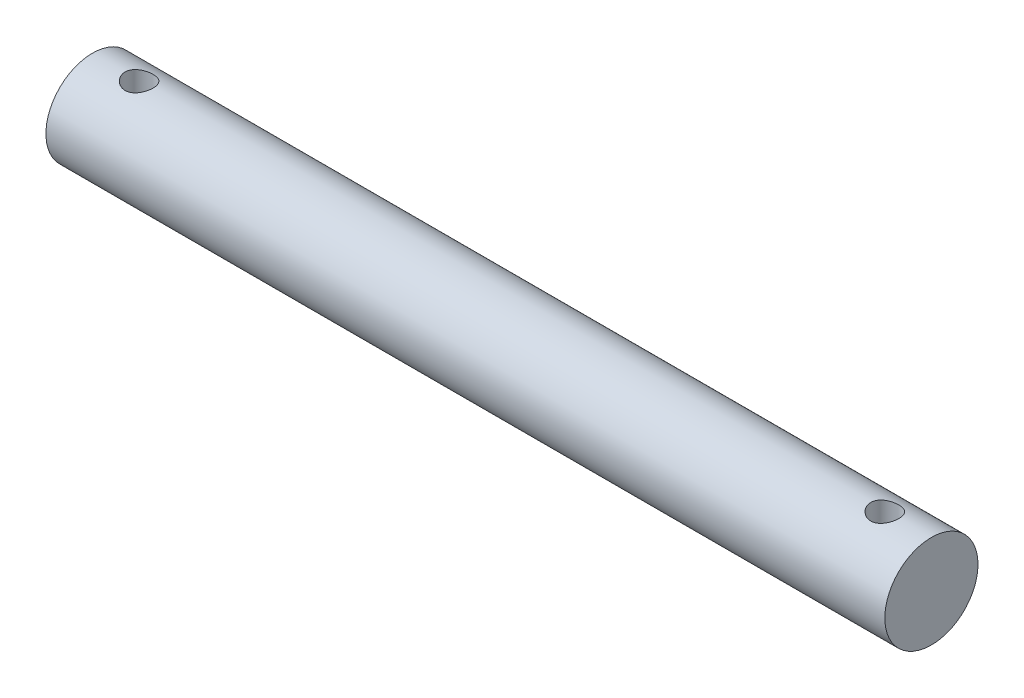
ISO-10303-21;
HEADER;
FILE_DESCRIPTION(('STEP AP214'),'2;1');
FILE_NAME('part.step','',(''),(''),'','','');
FILE_SCHEMA(('AUTOMOTIVE_DESIGN { 1 0 10303 214 1 1 1 1 }'));
ENDSEC;
DATA;
#1=APPLICATION_CONTEXT('core data for automotive mechanical design processes');
#2=APPLICATION_PROTOCOL_DEFINITION('international standard','automotive_design',2000,#1);
#3=PRODUCT_CONTEXT('',#1,'mechanical');
#4=PRODUCT('Part','Part','',(#3));
#5=PRODUCT_RELATED_PRODUCT_CATEGORY('part','',(#4));
#6=PRODUCT_DEFINITION_FORMATION('','',#4);
#7=PRODUCT_DEFINITION_CONTEXT('part definition',#1,'design');
#8=PRODUCT_DEFINITION('design','',#6,#7);
#9=PRODUCT_DEFINITION_SHAPE('','',#8);
#10=(LENGTH_UNIT() NAMED_UNIT(*) SI_UNIT(.MILLI.,.METRE.));
#11=(NAMED_UNIT(*) PLANE_ANGLE_UNIT() SI_UNIT($,.RADIAN.));
#12=(NAMED_UNIT(*) SI_UNIT($,.STERADIAN.) SOLID_ANGLE_UNIT());
#13=UNCERTAINTY_MEASURE_WITH_UNIT(LENGTH_MEASURE(1.E-05),#10,'distance_accuracy_value','');
#14=(GEOMETRIC_REPRESENTATION_CONTEXT(3) GLOBAL_UNCERTAINTY_ASSIGNED_CONTEXT((#13)) GLOBAL_UNIT_ASSIGNED_CONTEXT((#10,
#11,#12)) REPRESENTATION_CONTEXT('',''));
#15=CARTESIAN_POINT('',(0.,0.,0.));
#16=DIRECTION('',(0.,0.,1.));
#17=DIRECTION('',(1.,0.,0.));
#18=AXIS2_PLACEMENT_3D('',#15,#16,#17);
#19=CARTESIAN_POINT('',(45.,0.,0.));
#20=DIRECTION('',(-1.,0.,0.));
#21=DIRECTION('',(0.,0.,1.));
#22=AXIS2_PLACEMENT_3D('',#19,#20,#21);
#23=CYLINDRICAL_SURFACE('',#22,5.);
#24=CARTESIAN_POINT('',(-41.5,-5.,0.));
#25=CARTESIAN_POINT('',(-41.4999990025151,-4.9999992925055,0.0822886127533005));
#26=CARTESIAN_POINT('',(-41.493206136376,-4.99794915693954,0.164587318351531));
#27=CARTESIAN_POINT('',(-41.4662786457779,-4.98997105593691,0.326788125304882));
#28=CARTESIAN_POINT('',(-41.4461400419767,-4.98404193389692,0.406689504411421));
#29=CARTESIAN_POINT('',(-41.3932539830897,-4.96895552501836,0.561732707754528));
#30=CARTESIAN_POINT('',(-41.3605251303811,-4.95980300250425,0.636881364395375));
#31=CARTESIAN_POINT('',(-41.2834639069442,-4.93922109237645,0.780624181053134));
#32=CARTESIAN_POINT('',(-41.2391299926046,-4.92779140192067,0.849217467469671));
#33=CARTESIAN_POINT('',(-41.1387759925273,-4.90350737192774,0.979871797183748));
#34=CARTESIAN_POINT('',(-41.0824833741141,-4.89062383657036,1.04171807124434));
#35=CARTESIAN_POINT('',(-40.9603907700898,-4.86505834210442,1.15524920923324));
#36=CARTESIAN_POINT('',(-40.894589187875,-4.85237641724501,1.20693236327441));
#37=CARTESIAN_POINT('',(-40.7535292469624,-4.82834113993772,1.29980037723708));
#38=CARTESIAN_POINT('',(-40.6780915390093,-4.81702406663875,1.34072309022214));
#39=CARTESIAN_POINT('',(-40.5210107457697,-4.79743620394031,1.40921394774761));
#40=CARTESIAN_POINT('',(-40.439369156072,-4.78916468313311,1.43678529919974));
#41=CARTESIAN_POINT('',(-40.2746097338695,-4.77690870838434,1.47701633682652));
#42=CARTESIAN_POINT('',(-40.191597256136,-4.77281069324533,1.49007196234678));
#43=CARTESIAN_POINT('',(-40.0244668437832,-4.76902789749767,1.50213730614672));
#44=CARTESIAN_POINT('',(-39.9403491819409,-4.76934204760571,1.50115042761079));
#45=CARTESIAN_POINT('',(-39.7766160913915,-4.77424744067778,1.48546977199812));
#46=CARTESIAN_POINT('',(-39.6969477496378,-4.7786838859914,1.47127205262686));
#47=CARTESIAN_POINT('',(-39.5411802137265,-4.79108356228624,1.43037420427056));
#48=CARTESIAN_POINT('',(-39.4650813726257,-4.7990471413235,1.40367284141641));
#49=CARTESIAN_POINT('',(-39.3173996503393,-4.81772733074973,1.33816026653682));
#50=CARTESIAN_POINT('',(-39.2458929160447,-4.82848016115952,1.29918816934643));
#51=CARTESIAN_POINT('',(-39.1102679779898,-4.85150987000065,1.21035222588684));
#52=CARTESIAN_POINT('',(-39.0461515705862,-4.86378711746991,1.16048574002589));
#53=CARTESIAN_POINT('',(-38.924313809238,-4.88911011297937,1.04881290765547));
#54=CARTESIAN_POINT('',(-38.8669713359703,-4.90216654310498,0.986594907466972));
#55=CARTESIAN_POINT('',(-38.7634460159357,-4.92712244063259,0.853263259313965));
#56=CARTESIAN_POINT('',(-38.7172638715856,-4.9390218351841,0.782149051860887));
#57=CARTESIAN_POINT('',(-38.6371400775353,-4.9604316006947,0.632355038342802));
#58=CARTESIAN_POINT('',(-38.6032824837501,-4.96992543668314,0.553627749747948));
#59=CARTESIAN_POINT('',(-38.5494004099004,-4.98533521832222,0.391245415603517));
#60=CARTESIAN_POINT('',(-38.5293720714675,-4.99125216186999,0.30759175158958));
#61=CARTESIAN_POINT('',(-38.5043478221006,-4.99868364643538,0.140952242668331));
#62=CARTESIAN_POINT('',(-38.4988384141984,-5.0003485041779,0.0580500976011859));
#63=CARTESIAN_POINT('',(-38.5015691557121,-4.9995292324176,-0.107499605823384));
#64=CARTESIAN_POINT('',(-38.5098074696514,-4.99704565677756,-0.190147196690782));
#65=CARTESIAN_POINT('',(-38.5393846111115,-4.98830696987163,-0.350903605309698));
#66=CARTESIAN_POINT('',(-38.5604233875809,-4.98213829799417,-0.429072772614171));
#67=CARTESIAN_POINT('',(-38.6146432327782,-4.96674347841532,-0.580754638954524));
#68=CARTESIAN_POINT('',(-38.6478257610379,-4.95751696321085,-0.654266777025585));
#69=CARTESIAN_POINT('',(-38.7262531654811,-4.93669654351325,-0.796437189461055));
#70=CARTESIAN_POINT('',(-38.771759340948,-4.92505280829675,-0.864943826199673));
#71=CARTESIAN_POINT('',(-38.8732247540528,-4.90073468764317,-0.993523307980149));
#72=CARTESIAN_POINT('',(-38.9291866118877,-4.8880600443108,-1.05359403235594));
#73=CARTESIAN_POINT('',(-39.0523873083693,-4.86253171869138,-1.16585744551027));
#74=CARTESIAN_POINT('',(-39.1199618757717,-4.84968825033267,-1.21768481231504));
#75=CARTESIAN_POINT('',(-39.2631279390135,-4.82576515238463,-1.30928995072154));
#76=CARTESIAN_POINT('',(-39.3387192245582,-4.81468547654651,-1.34906803829472));
#77=CARTESIAN_POINT('',(-39.4955324912547,-4.79567189615055,-1.41517347127169));
#78=CARTESIAN_POINT('',(-39.5767261865366,-4.78772337843827,-1.4415634693705));
#79=CARTESIAN_POINT('',(-39.7426879689315,-4.77591594362794,-1.48021730815114));
#80=CARTESIAN_POINT('',(-39.8274548207877,-4.772055625083,-1.49248598978779));
#81=CARTESIAN_POINT('',(-39.9943615183762,-4.76899972496087,-1.50221984485059));
#82=CARTESIAN_POINT('',(-40.0764636510176,-4.76961647442754,-1.5002805530849));
#83=CARTESIAN_POINT('',(-40.2391141033728,-4.77499401288294,-1.48307505444814));
#84=CARTESIAN_POINT('',(-40.3196624851764,-4.77975463592551,-1.46780938124716));
#85=CARTESIAN_POINT('',(-40.4759453991429,-4.79275763670385,-1.42476888804136));
#86=CARTESIAN_POINT('',(-40.5517272873617,-4.80095604545964,-1.39715175507069));
#87=CARTESIAN_POINT('',(-40.6976424388177,-4.81990278909136,-1.3303150712113));
#88=CARTESIAN_POINT('',(-40.7677746176408,-4.83065161194312,-1.29109329962877));
#89=CARTESIAN_POINT('',(-40.9031631165271,-4.85397676425833,-1.20048763805072));
#90=CARTESIAN_POINT('',(-40.9681487612604,-4.86660540163797,-1.14871276092994));
#91=CARTESIAN_POINT('',(-41.0887024983079,-4.89201320450026,-1.03517434629782));
#92=CARTESIAN_POINT('',(-41.1442681394678,-4.90479240823905,-0.973408217134501));
#93=CARTESIAN_POINT('',(-41.246023412295,-4.92950936570649,-0.839465762183247));
#94=CARTESIAN_POINT('',(-41.2918914468555,-4.94141159765674,-0.767037885790606));
#95=CARTESIAN_POINT('',(-41.370735169904,-4.96260680455813,-0.615141373983527));
#96=CARTESIAN_POINT('',(-41.4037168882745,-4.97190099931067,-0.535676052998953));
#97=CARTESIAN_POINT('',(-41.4528952756528,-4.98602174969301,-0.38075771265528));
#98=CARTESIAN_POINT('',(-41.4705116728832,-4.99122027381068,-0.305786961954234));
#99=CARTESIAN_POINT('',(-41.4940635252416,-4.99820944494492,-0.15388019523078));
#100=CARTESIAN_POINT('',(-41.5000009327048,-5.0000006615474,-0.0769445098581401));
#101=CARTESIAN_POINT('',(-41.5,-5.,0.));
#102=B_SPLINE_CURVE_WITH_KNOTS('',3,(#24,#25,#26,#27,#28,#29,#30,#31,#32,#33,#34,#35,#36,#37,
#38,#39,#40,#41,#42,#43,#44,#45,#46,#47,#48,#49,#50,#51,#52,#53,#54,#55,#56,#57,#58,#59,#60,#61,
#62,#63,#64,#65,#66,#67,#68,#69,#70,#71,#72,#73,#74,#75,#76,#77,#78,#79,#80,#81,#82,#83,#84,#85,
#86,#87,#88,#89,#90,#91,#92,#93,#94,#95,#96,#97,#98,#99,#100,#101),.UNSPECIFIED.,.T.,.F.,(4,2,2,
2,2,2,2,2,2,2,2,2,2,2,2,2,2,2,2,2,2,2,2,2,2,2,2,2,2,2,2,2,2,2,2,2,2,2,4),(0.,0.246583203612612,
0.493239964846002,0.739533676300877,0.985860164412705,1.23855602948192,1.49129437288634,
1.74971481004109,2.00807314543224,2.259196893566,2.5102597831909,2.75226016697677,
2.99428443658002,3.23962426447121,3.48502360158556,3.74067104048168,3.99633456531073,
4.2537104688169,4.51101453528809,4.75908809438546,5.00712853550328,5.24956746682328,
5.4920355459373,5.7401130570291,5.98825282000192,6.2454040032282,6.50254844252682,
6.75847814951253,7.01432009460284,7.25950155466945,7.50467319661602,7.74680040402723,
7.98897397553109,8.23996925679933,8.49102974897505,8.74942996156673,9.00770911595238,
9.23831691930462,9.46888616948876),.UNSPECIFIED.);
#103=CARTESIAN_POINT('',(-41.5,-5.,0.));
#104=VERTEX_POINT('',#103);
#105=EDGE_CURVE('E46',#104,#104,#102,.T.);
#106=ORIENTED_EDGE('',*,*,#105,.T.);
#107=EDGE_LOOP('',(#106));
#108=FACE_BOUND('',#107,.T.);
#109=CARTESIAN_POINT('',(-40.,4.76969600708473,1.5));
#110=CARTESIAN_POINT('',(-40.0821945479424,4.7696968572698,1.49999897633764));
#111=CARTESIAN_POINT('',(-40.164399224144,4.77184390209069,1.49322108167143));
#112=CARTESIAN_POINT('',(-40.3264052495919,4.780165783029,1.4663584444675));
#113=CARTESIAN_POINT('',(-40.4062057865015,4.78634196493468,1.44626925573578));
#114=CARTESIAN_POINT('',(-40.5610347282717,4.80196102485632,1.39352753269956));
#115=CARTESIAN_POINT('',(-40.6360708296331,4.81139846703232,1.36089589394244));
#116=CARTESIAN_POINT('',(-40.7796219339953,4.83246932547567,1.28406421917929));
#117=CARTESIAN_POINT('',(-40.8481359586844,4.84410307041019,1.23986245137053));
#118=CARTESIAN_POINT('',(-40.9788663905774,4.86866862185765,1.13964754141627));
#119=CARTESIAN_POINT('',(-41.0408458979463,4.88162808311635,1.08333207175807));
#120=CARTESIAN_POINT('',(-41.1546379513225,4.90714861936757,0.9611362375796));
#121=CARTESIAN_POINT('',(-41.2064491904499,4.91970964297705,0.895254645461112));
#122=CARTESIAN_POINT('',(-41.2994626998333,4.94333214579389,0.754111437793689));
#123=CARTESIAN_POINT('',(-41.3404234244428,4.95435724342404,0.678684021335813));
#124=CARTESIAN_POINT('',(-41.4089872590428,4.97334435920684,0.521624645369354));
#125=CARTESIAN_POINT('',(-41.4365932498574,4.98130703789495,0.439994028387914));
#126=CARTESIAN_POINT('',(-41.4768800010905,4.99307646003589,0.275323852630834));
#127=CARTESIAN_POINT('',(-41.4899651276527,4.99699557369338,0.192391398953805));
#128=CARTESIAN_POINT('',(-41.5021173246464,5.00063201501348,0.0254218237493175));
#129=CARTESIAN_POINT('',(-41.501187339402,5.00035022521079,-0.0586150620503666));
#130=CARTESIAN_POINT('',(-41.485607131457,4.99569603817659,-0.22257115660016));
#131=CARTESIAN_POINT('',(-41.4713948061901,4.9914542020526,-0.302536267641341));
#132=CARTESIAN_POINT('',(-41.4303686640057,4.97951522112593,-0.458889213442528));
#133=CARTESIAN_POINT('',(-41.4035540490573,4.97181785750586,-0.535276821322847));
#134=CARTESIAN_POINT('',(-41.3377879765814,4.95365220986963,-0.683347326351282));
#135=CARTESIAN_POINT('',(-41.2986987971927,4.94315269676706,-0.754965064694479));
#136=CARTESIAN_POINT('',(-41.2096021475718,4.92049640648069,-0.890764673783157));
#137=CARTESIAN_POINT('',(-41.1595920870365,4.90833923637778,-0.954944774872132));
#138=CARTESIAN_POINT('',(-41.0478022492484,4.88311550488165,-1.0766604815298));
#139=CARTESIAN_POINT('',(-40.9856430809703,4.87003195321461,-1.13384458040112));
#140=CARTESIAN_POINT('',(-40.85248998211,4.84483979887497,-1.23707651539824));
#141=CARTESIAN_POINT('',(-40.7814951746108,4.8327312931702,-1.28312324482853));
#142=CARTESIAN_POINT('',(-40.631760530751,4.81077903197678,-1.3631399533545));
#143=CARTESIAN_POINT('',(-40.5529529541371,4.80095810695957,-1.3969898923768));
#144=CARTESIAN_POINT('',(-40.3903927915545,4.78496392548436,-1.45083362878414));
#145=CARTESIAN_POINT('',(-40.3066418284654,4.77878947915829,-1.4708319464056));
#146=CARTESIAN_POINT('',(-40.1399176392607,4.77104849541241,-1.49574770282166));
#147=CARTESIAN_POINT('',(-40.057031776106,4.7693187867044,-1.50119946380212));
#148=CARTESIAN_POINT('',(-39.8915270999901,4.77021192441924,-1.49835947233063));
#149=CARTESIAN_POINT('',(-39.8089082512692,4.77283416156589,-1.49006964371331));
#150=CARTESIAN_POINT('',(-39.6485116220291,4.78197558554912,-1.46045763574191));
#151=CARTESIAN_POINT('',(-39.5706638357365,4.78839176507489,-1.43947961431281));
#152=CARTESIAN_POINT('',(-39.4195983091851,4.80429141231227,-1.3854857774794));
#153=CARTESIAN_POINT('',(-39.3463812858594,4.81377535359073,-1.3524681034276));
#154=CARTESIAN_POINT('',(-39.2044825359279,4.83505835023047,-1.27431871196501));
#155=CARTESIAN_POINT('',(-39.1359752790142,4.84691271069798,-1.2288856417273));
#156=CARTESIAN_POINT('',(-39.0073618938192,4.87148205646987,-1.12755301600385));
#157=CARTESIAN_POINT('',(-38.9472577823872,4.88419724730003,-1.07165095534897));
#158=CARTESIAN_POINT('',(-38.8348195941853,4.90963633548158,-0.948455132493605));
#159=CARTESIAN_POINT('',(-38.782864371013,4.92234245063004,-0.880811065857438));
#160=CARTESIAN_POINT('',(-38.6910332989723,4.94584851748651,-0.737461784590251));
#161=CARTESIAN_POINT('',(-38.6511568502185,4.95664856384717,-0.661756970543946));
#162=CARTESIAN_POINT('',(-38.5849999694317,4.97505970474957,-0.504935504705223));
#163=CARTESIAN_POINT('',(-38.558617983841,4.98269453424966,-0.423864622037841));
#164=CARTESIAN_POINT('',(-38.5199390811096,4.99401979596827,-0.258169966504589));
#165=CARTESIAN_POINT('',(-38.5076381340516,4.9977113567088,-0.173547217354763));
#166=CARTESIAN_POINT('',(-38.4977769559455,5.00066544081399,-0.00665215388274238));
#167=CARTESIAN_POINT('',(-38.4996673045922,5.00009305111322,0.0755851790862072));
#168=CARTESIAN_POINT('',(-38.5168216324991,4.99497264465037,0.238519481164404));
#169=CARTESIAN_POINT('',(-38.5320848534804,4.99042485330463,0.319216537346528));
#170=CARTESIAN_POINT('',(-38.5752116613996,4.97791168358326,0.475935813041359));
#171=CARTESIAN_POINT('',(-38.602938180649,4.96998352900866,0.551998927351394));
#172=CARTESIAN_POINT('',(-38.6700819145072,4.9515294303945,0.698433237752056));
#173=CARTESIAN_POINT('',(-38.7095010502862,4.94100305949946,0.768803496050581));
#174=CARTESIAN_POINT('',(-38.80037345743,4.91803965828228,0.904301892420565));
#175=CARTESIAN_POINT('',(-38.8521714300008,4.90555226923559,0.969190250076771));
#176=CARTESIAN_POINT('',(-38.9657103883328,4.88023537212334,1.08953757134595));
#177=CARTESIAN_POINT('',(-39.0274542378981,4.86740576641079,1.14499380960194));
#178=CARTESIAN_POINT('',(-39.1613407783105,4.84240680631319,1.24656269394549));
#179=CARTESIAN_POINT('',(-39.2337385533904,4.83026852693485,1.29234759757956));
#180=CARTESIAN_POINT('',(-39.385555174161,4.80852547508793,1.37104313528776));
#181=CARTESIAN_POINT('',(-39.4649706236012,4.79891948596955,1.40395995557289));
#182=CARTESIAN_POINT('',(-39.6197404316063,4.78427816717594,1.4530194253295));
#183=CARTESIAN_POINT('',(-39.694608646931,4.7788615484052,1.47058859011232));
#184=CARTESIAN_POINT('',(-39.8463152224958,4.77157042597166,1.49407818835144));
#185=CARTESIAN_POINT('',(-39.9231531846452,4.76969521221431,1.50000095706096));
#186=CARTESIAN_POINT('',(-40.,4.76969600708473,1.5));
#187=B_SPLINE_CURVE_WITH_KNOTS('',3,(#109,#110,#111,#112,#113,#114,#115,#116,#117,#118,#119,
#120,#121,#122,#123,#124,#125,#126,#127,#128,#129,#130,#131,#132,#133,#134,#135,#136,#137,#138,
#139,#140,#141,#142,#143,#144,#145,#146,#147,#148,#149,#150,#151,#152,#153,#154,#155,#156,#157,
#158,#159,#160,#161,#162,#163,#164,#165,#166,#167,#168,#169,#170,#171,#172,#173,#174,#175,#176,
#177,#178,#179,#180,#181,#182,#183,#184,#185,#186),.UNSPECIFIED.,.T.,.F.,(4,2,2,2,2,2,2,2,2,2,2,
2,2,2,2,2,2,2,2,2,2,2,2,2,2,2,2,2,2,2,2,2,2,2,2,2,2,2,4),(0.,0.246300165915542,
0.492682641689001,0.738656414466199,0.984667025370097,1.23773150007984,1.49082847871274,
1.74915939273645,2.00743455587877,2.25832140149558,2.50915554101441,2.75200125990881,
2.99486235890377,3.24055209335677,3.48630016590832,3.74152147023279,3.99676812491864,
4.25446238246267,4.51207250628412,4.7600808079031,5.00805439107388,5.24958594938817,
5.49115481045788,5.73920731809389,5.98731925928924,6.24479506100603,6.50225807324203,
6.75775391814326,7.01317662321684,7.25876303911222,7.50433553047756,7.74727096872221,
7.9902463449138,8.2409962705449,8.49181852629892,8.75011639669149,9.00828993963946,
9.2386115385745,9.46888695033562),.UNSPECIFIED.);
#188=CARTESIAN_POINT('',(-40.,4.76969600708473,1.5));
#189=VERTEX_POINT('',#188);
#190=EDGE_CURVE('E50',#189,#189,#187,.T.);
#191=ORIENTED_EDGE('',*,*,#190,.T.);
#192=EDGE_LOOP('',(#191));
#193=FACE_BOUND('',#192,.T.);
#194=CARTESIAN_POINT('',(45.,0.,0.));
#195=DIRECTION('',(1.,0.,0.));
#196=DIRECTION('',(0.,0.,-1.));
#197=AXIS2_PLACEMENT_3D('',#194,#195,#196);
#198=CIRCLE('',#197,5.);
#199=CARTESIAN_POINT('',(45.,0.,-5.));
#200=VERTEX_POINT('',#199);
#201=EDGE_CURVE('E77',#200,#200,#198,.T.);
#202=ORIENTED_EDGE('',*,*,#201,.F.);
#203=EDGE_LOOP('',(#202));
#204=FACE_BOUND('',#203,.T.);
#205=CARTESIAN_POINT('',(-45.,0.,0.));
#206=DIRECTION('',(1.,0.,0.));
#207=DIRECTION('',(0.,0.,-1.));
#208=AXIS2_PLACEMENT_3D('',#205,#206,#207);
#209=CIRCLE('',#208,5.);
#210=CARTESIAN_POINT('',(-45.,0.,-5.));
#211=VERTEX_POINT('',#210);
#212=EDGE_CURVE('E78',#211,#211,#209,.T.);
#213=ORIENTED_EDGE('',*,*,#212,.T.);
#214=EDGE_LOOP('',(#213));
#215=FACE_BOUND('',#214,.T.);
#216=CARTESIAN_POINT('',(40.,4.76969600708473,1.5));
#217=CARTESIAN_POINT('',(40.0821945479424,4.7696968572698,1.49999897633764));
#218=CARTESIAN_POINT('',(40.164399224144,4.77184390209069,1.49322108167143));
#219=CARTESIAN_POINT('',(40.3264052495919,4.780165783029,1.4663584444675));
#220=CARTESIAN_POINT('',(40.4062057865015,4.78634196493468,1.44626925573578));
#221=CARTESIAN_POINT('',(40.5610347282717,4.80196102485632,1.39352753269956));
#222=CARTESIAN_POINT('',(40.6360708296331,4.81139846703232,1.36089589394244));
#223=CARTESIAN_POINT('',(40.7796219339953,4.83246932547567,1.28406421917929));
#224=CARTESIAN_POINT('',(40.8481359586844,4.84410307041019,1.23986245137053));
#225=CARTESIAN_POINT('',(40.9788663905774,4.86866862185765,1.13964754141627));
#226=CARTESIAN_POINT('',(41.0408458979463,4.88162808311635,1.08333207175807));
#227=CARTESIAN_POINT('',(41.1546379513225,4.90714861936757,0.9611362375796));
#228=CARTESIAN_POINT('',(41.2064491904499,4.91970964297705,0.895254645461112));
#229=CARTESIAN_POINT('',(41.2994626998333,4.94333214579389,0.754111437793688));
#230=CARTESIAN_POINT('',(41.3404234244428,4.95435724342404,0.678684021335812));
#231=CARTESIAN_POINT('',(41.4089872590428,4.97334435920684,0.521624645369353));
#232=CARTESIAN_POINT('',(41.4365932498574,4.98130703789495,0.439994028387913));
#233=CARTESIAN_POINT('',(41.4768800010905,4.99307646003589,0.275323852630832));
#234=CARTESIAN_POINT('',(41.4899651276527,4.99699557369338,0.192391398953803));
#235=CARTESIAN_POINT('',(41.5021173246464,5.00063201501348,0.0254218237493155));
#236=CARTESIAN_POINT('',(41.501187339402,5.00035022521079,-0.0586150620503688));
#237=CARTESIAN_POINT('',(41.485607131457,4.99569603817659,-0.222571156600162));
#238=CARTESIAN_POINT('',(41.4713948061901,4.9914542020526,-0.302536267641343));
#239=CARTESIAN_POINT('',(41.4303686640057,4.97951522112593,-0.458889213442529));
#240=CARTESIAN_POINT('',(41.4035540490573,4.97181785750586,-0.535276821322848));
#241=CARTESIAN_POINT('',(41.3377879765814,4.95365220986963,-0.683347326351283));
#242=CARTESIAN_POINT('',(41.2986987971927,4.94315269676706,-0.754965064694479));
#243=CARTESIAN_POINT('',(41.2096021475718,4.92049640648069,-0.890764673783157));
#244=CARTESIAN_POINT('',(41.1595920870365,4.90833923637778,-0.954944774872132));
#245=CARTESIAN_POINT('',(41.0478022492484,4.88311550488165,-1.0766604815298));
#246=CARTESIAN_POINT('',(40.9856430809703,4.87003195321461,-1.13384458040112));
#247=CARTESIAN_POINT('',(40.85248998211,4.84483979887497,-1.23707651539824));
#248=CARTESIAN_POINT('',(40.7814951746108,4.8327312931702,-1.28312324482853));
#249=CARTESIAN_POINT('',(40.631760530751,4.81077903197678,-1.3631399533545));
#250=CARTESIAN_POINT('',(40.5529529541371,4.80095810695957,-1.3969898923768));
#251=CARTESIAN_POINT('',(40.3903927915545,4.78496392548436,-1.45083362878414));
#252=CARTESIAN_POINT('',(40.3066418284654,4.77878947915829,-1.4708319464056));
#253=CARTESIAN_POINT('',(40.1399176392607,4.77104849541241,-1.49574770282166));
#254=CARTESIAN_POINT('',(40.057031776106,4.7693187867044,-1.50119946380212));
#255=CARTESIAN_POINT('',(39.8915270999901,4.77021192441924,-1.49835947233063));
#256=CARTESIAN_POINT('',(39.8089082512692,4.77283416156589,-1.49006964371331));
#257=CARTESIAN_POINT('',(39.6485116220291,4.78197558554912,-1.46045763574191));
#258=CARTESIAN_POINT('',(39.5706638357365,4.78839176507489,-1.43947961431281));
#259=CARTESIAN_POINT('',(39.4195983091851,4.80429141231227,-1.3854857774794));
#260=CARTESIAN_POINT('',(39.3463812858594,4.81377535359073,-1.3524681034276));
#261=CARTESIAN_POINT('',(39.2044825359279,4.83505835023047,-1.27431871196501));
#262=CARTESIAN_POINT('',(39.1359752790142,4.84691271069799,-1.22888564172729));
#263=CARTESIAN_POINT('',(39.0073618938192,4.87148205646987,-1.12755301600385));
#264=CARTESIAN_POINT('',(38.9472577823872,4.88419724730003,-1.07165095534897));
#265=CARTESIAN_POINT('',(38.8348195941853,4.90963633548158,-0.948455132493604));
#266=CARTESIAN_POINT('',(38.782864371013,4.92234245063004,-0.880811065857438));
#267=CARTESIAN_POINT('',(38.6910332989723,4.94584851748651,-0.737461784590251));
#268=CARTESIAN_POINT('',(38.6511568502185,4.95664856384717,-0.661756970543946));
#269=CARTESIAN_POINT('',(38.5849999694317,4.97505970474957,-0.504935504705222));
#270=CARTESIAN_POINT('',(38.558617983841,4.98269453424966,-0.423864622037839));
#271=CARTESIAN_POINT('',(38.5199390811096,4.99401979596827,-0.258169966504587));
#272=CARTESIAN_POINT('',(38.5076381340516,4.9977113567088,-0.173547217354762));
#273=CARTESIAN_POINT('',(38.4977769559455,5.00066544081399,-0.00665215388274193));
#274=CARTESIAN_POINT('',(38.4996673045922,5.00009305111322,0.0755851790862077));
#275=CARTESIAN_POINT('',(38.5168216324991,4.99497264465037,0.238519481164405));
#276=CARTESIAN_POINT('',(38.5320848534804,4.99042485330463,0.319216537346529));
#277=CARTESIAN_POINT('',(38.5752116613996,4.97791168358326,0.47593581304136));
#278=CARTESIAN_POINT('',(38.602938180649,4.96998352900866,0.551998927351395));
#279=CARTESIAN_POINT('',(38.6700819145072,4.9515294303945,0.698433237752057));
#280=CARTESIAN_POINT('',(38.7095010502862,4.94100305949946,0.768803496050582));
#281=CARTESIAN_POINT('',(38.80037345743,4.91803965828228,0.904301892420566));
#282=CARTESIAN_POINT('',(38.8521714300008,4.90555226923559,0.969190250076772));
#283=CARTESIAN_POINT('',(38.9657103883328,4.88023537212334,1.08953757134595));
#284=CARTESIAN_POINT('',(39.0274542378981,4.86740576641079,1.14499380960194));
#285=CARTESIAN_POINT('',(39.1613407783105,4.84240680631319,1.24656269394549));
#286=CARTESIAN_POINT('',(39.2337385533904,4.83026852693485,1.29234759757957));
#287=CARTESIAN_POINT('',(39.385555174161,4.80852547508793,1.37104313528776));
#288=CARTESIAN_POINT('',(39.4649706236012,4.79891948596955,1.40395995557289));
#289=CARTESIAN_POINT('',(39.6197404316063,4.78427816717594,1.4530194253295));
#290=CARTESIAN_POINT('',(39.694608646931,4.7788615484052,1.47058859011232));
#291=CARTESIAN_POINT('',(39.8463152224958,4.77157042597166,1.49407818835144));
#292=CARTESIAN_POINT('',(39.9231531846452,4.76969521221431,1.50000095706096));
#293=CARTESIAN_POINT('',(40.,4.76969600708473,1.5));
#294=B_SPLINE_CURVE_WITH_KNOTS('',3,(#216,#217,#218,#219,#220,#221,#222,#223,#224,#225,#226,
#227,#228,#229,#230,#231,#232,#233,#234,#235,#236,#237,#238,#239,#240,#241,#242,#243,#244,#245,
#246,#247,#248,#249,#250,#251,#252,#253,#254,#255,#256,#257,#258,#259,#260,#261,#262,#263,#264,
#265,#266,#267,#268,#269,#270,#271,#272,#273,#274,#275,#276,#277,#278,#279,#280,#281,#282,#283,
#284,#285,#286,#287,#288,#289,#290,#291,#292,#293),.UNSPECIFIED.,.T.,.F.,(4,2,2,2,2,2,2,2,2,2,2,
2,2,2,2,2,2,2,2,2,2,2,2,2,2,2,2,2,2,2,2,2,2,2,2,2,2,2,4),(0.,0.246300165915542,
0.492682641689001,0.738656414466199,0.984667025370097,1.23773150007984,1.49082847871274,
1.74915939273645,2.00743455587877,2.25832140149558,2.50915554101441,2.75200125990881,
2.99486235890377,3.24055209335677,3.48630016590832,3.74152147023279,3.99676812491864,
4.25446238246267,4.51207250628412,4.7600808079031,5.00805439107388,5.24958594938817,
5.49115481045789,5.7392073180939,5.98731925928924,6.24479506100603,6.50225807324203,
6.75775391814327,7.01317662321684,7.25876303911222,7.50433553047756,7.74727096872221,
7.9902463449138,8.2409962705449,8.49181852629892,8.75011639669149,9.00828993963946,
9.2386115385745,9.46888695033562),.UNSPECIFIED.);
#295=CARTESIAN_POINT('',(40.,4.76969600708473,1.5));
#296=VERTEX_POINT('',#295);
#297=EDGE_CURVE('E42',#296,#296,#294,.T.);
#298=ORIENTED_EDGE('',*,*,#297,.F.);
#299=EDGE_LOOP('',(#298));
#300=FACE_BOUND('',#299,.T.);
#301=CARTESIAN_POINT('',(38.5,-5.,0.));
#302=CARTESIAN_POINT('',(38.5000009974849,-4.9999992925055,-0.0822886127533005));
#303=CARTESIAN_POINT('',(38.506793863624,-4.99794915693954,-0.164587318351531));
#304=CARTESIAN_POINT('',(38.5337213542221,-4.98997105593691,-0.326788125304882));
#305=CARTESIAN_POINT('',(38.5538599580233,-4.98404193389692,-0.406689504411421));
#306=CARTESIAN_POINT('',(38.6067460169103,-4.96895552501836,-0.561732707754528));
#307=CARTESIAN_POINT('',(38.6394748696189,-4.95980300250425,-0.636881364395375));
#308=CARTESIAN_POINT('',(38.7165360930558,-4.93922109237645,-0.780624181053133));
#309=CARTESIAN_POINT('',(38.7608700073954,-4.92779140192067,-0.849217467469671));
#310=CARTESIAN_POINT('',(38.8612240074727,-4.90350737192774,-0.979871797183749));
#311=CARTESIAN_POINT('',(38.9175166258859,-4.89062383657036,-1.04171807124435));
#312=CARTESIAN_POINT('',(39.0396092299102,-4.86505834210442,-1.15524920923324));
#313=CARTESIAN_POINT('',(39.105410812125,-4.85237641724501,-1.20693236327441));
#314=CARTESIAN_POINT('',(39.2464707530376,-4.82834113993772,-1.29980037723708));
#315=CARTESIAN_POINT('',(39.3219084609907,-4.81702406663875,-1.34072309022214));
#316=CARTESIAN_POINT('',(39.4789892542303,-4.79743620394031,-1.40921394774761));
#317=CARTESIAN_POINT('',(39.560630843928,-4.78916468313311,-1.43678529919974));
#318=CARTESIAN_POINT('',(39.7253902661305,-4.77690870838434,-1.47701633682652));
#319=CARTESIAN_POINT('',(39.808402743864,-4.77281069324533,-1.49007196234678));
#320=CARTESIAN_POINT('',(39.9755331562168,-4.76902789749767,-1.50213730614672));
#321=CARTESIAN_POINT('',(40.0596508180591,-4.76934204760571,-1.50115042761079));
#322=CARTESIAN_POINT('',(40.2233839086085,-4.77424744067778,-1.48546977199812));
#323=CARTESIAN_POINT('',(40.3030522503622,-4.7786838859914,-1.47127205262686));
#324=CARTESIAN_POINT('',(40.4588197862735,-4.79108356228624,-1.43037420427056));
#325=CARTESIAN_POINT('',(40.5349186273743,-4.7990471413235,-1.40367284141641));
#326=CARTESIAN_POINT('',(40.6826003496607,-4.81772733074973,-1.33816026653682));
#327=CARTESIAN_POINT('',(40.7541070839553,-4.82848016115952,-1.29918816934643));
#328=CARTESIAN_POINT('',(40.8897320220102,-4.85150987000065,-1.21035222588684));
#329=CARTESIAN_POINT('',(40.9538484294138,-4.86378711746991,-1.16048574002589));
#330=CARTESIAN_POINT('',(41.075686190762,-4.88911011297937,-1.04881290765547));
#331=CARTESIAN_POINT('',(41.1330286640297,-4.90216654310498,-0.986594907466972));
#332=CARTESIAN_POINT('',(41.2365539840643,-4.92712244063259,-0.853263259313965));
#333=CARTESIAN_POINT('',(41.2827361284144,-4.9390218351841,-0.782149051860887));
#334=CARTESIAN_POINT('',(41.3628599224647,-4.9604316006947,-0.632355038342803));
#335=CARTESIAN_POINT('',(41.3967175162499,-4.96992543668314,-0.55362774974795));
#336=CARTESIAN_POINT('',(41.4505995900996,-4.98533521832222,-0.391245415603518));
#337=CARTESIAN_POINT('',(41.4706279285325,-4.99125216186999,-0.307591751589581));
#338=CARTESIAN_POINT('',(41.4956521778994,-4.99868364643538,-0.140952242668331));
#339=CARTESIAN_POINT('',(41.5011615858016,-5.0003485041779,-0.0580500976011858));
#340=CARTESIAN_POINT('',(41.4984308442879,-4.9995292324176,0.107499605823384));
#341=CARTESIAN_POINT('',(41.4901925303486,-4.99704565677756,0.190147196690782));
#342=CARTESIAN_POINT('',(41.4606153888885,-4.98830696987163,0.350903605309699));
#343=CARTESIAN_POINT('',(41.4395766124191,-4.98213829799417,0.429072772614172));
#344=CARTESIAN_POINT('',(41.3853567672218,-4.96674347841532,0.580754638954524));
#345=CARTESIAN_POINT('',(41.3521742389621,-4.95751696321085,0.654266777025586));
#346=CARTESIAN_POINT('',(41.2737468345189,-4.93669654351325,0.796437189461056));
#347=CARTESIAN_POINT('',(41.228240659052,-4.92505280829675,0.864943826199674));
#348=CARTESIAN_POINT('',(41.1267752459472,-4.90073468764317,0.993523307980152));
#349=CARTESIAN_POINT('',(41.0708133881123,-4.8880600443108,1.05359403235594));
#350=CARTESIAN_POINT('',(40.9476126916307,-4.86253171869138,1.16585744551027));
#351=CARTESIAN_POINT('',(40.8800381242283,-4.84968825033267,1.21768481231504));
#352=CARTESIAN_POINT('',(40.7368720609865,-4.82576515238463,1.30928995072154));
#353=CARTESIAN_POINT('',(40.6612807754418,-4.81468547654651,1.34906803829472));
#354=CARTESIAN_POINT('',(40.5044675087453,-4.79567189615055,1.41517347127168));
#355=CARTESIAN_POINT('',(40.4232738134634,-4.78772337843827,1.4415634693705));
#356=CARTESIAN_POINT('',(40.2573120310685,-4.77591594362794,1.48021730815114));
#357=CARTESIAN_POINT('',(40.1725451792123,-4.772055625083,1.49248598978779));
#358=CARTESIAN_POINT('',(40.0056384816238,-4.76899972496087,1.50221984485059));
#359=CARTESIAN_POINT('',(39.9235363489824,-4.76961647442754,1.5002805530849));
#360=CARTESIAN_POINT('',(39.7608858966272,-4.77499401288294,1.48307505444814));
#361=CARTESIAN_POINT('',(39.6803375148237,-4.77975463592551,1.46780938124716));
#362=CARTESIAN_POINT('',(39.5240546008571,-4.79275763670385,1.42476888804136));
#363=CARTESIAN_POINT('',(39.4482727126383,-4.80095604545964,1.39715175507069));
#364=CARTESIAN_POINT('',(39.3023575611823,-4.81990278909136,1.3303150712113));
#365=CARTESIAN_POINT('',(39.2322253823592,-4.83065161194312,1.29109329962877));
#366=CARTESIAN_POINT('',(39.0968368834729,-4.85397676425833,1.20048763805072));
#367=CARTESIAN_POINT('',(39.0318512387396,-4.86660540163797,1.14871276092994));
#368=CARTESIAN_POINT('',(38.9112975016921,-4.89201320450026,1.03517434629782));
#369=CARTESIAN_POINT('',(38.8557318605322,-4.90479240823905,0.973408217134501));
#370=CARTESIAN_POINT('',(38.753976587705,-4.92950936570649,0.839465762183247));
#371=CARTESIAN_POINT('',(38.7081085531445,-4.94141159765674,0.767037885790606));
#372=CARTESIAN_POINT('',(38.629264830096,-4.96260680455813,0.615141373983527));
#373=CARTESIAN_POINT('',(38.5962831117255,-4.97190099931067,0.535676052998952));
#374=CARTESIAN_POINT('',(38.5471047243472,-4.98602174969301,0.38075771265528));
#375=CARTESIAN_POINT('',(38.5294883271168,-4.99122027381068,0.305786961954233));
#376=CARTESIAN_POINT('',(38.5059364747584,-4.99820944494492,0.15388019523078));
#377=CARTESIAN_POINT('',(38.4999990672952,-5.0000006615474,0.0769445098581398));
#378=CARTESIAN_POINT('',(38.5,-5.,0.));
#379=B_SPLINE_CURVE_WITH_KNOTS('',3,(#301,#302,#303,#304,#305,#306,#307,#308,#309,#310,#311,
#312,#313,#314,#315,#316,#317,#318,#319,#320,#321,#322,#323,#324,#325,#326,#327,#328,#329,#330,
#331,#332,#333,#334,#335,#336,#337,#338,#339,#340,#341,#342,#343,#344,#345,#346,#347,#348,#349,
#350,#351,#352,#353,#354,#355,#356,#357,#358,#359,#360,#361,#362,#363,#364,#365,#366,#367,#368,
#369,#370,#371,#372,#373,#374,#375,#376,#377,#378),.UNSPECIFIED.,.T.,.F.,(4,2,2,2,2,2,2,2,2,2,2,
2,2,2,2,2,2,2,2,2,2,2,2,2,2,2,2,2,2,2,2,2,2,2,2,2,2,2,4),(0.,0.246583203612611,
0.493239964846001,0.739533676300877,0.985860164412704,1.23855602948192,1.49129437288634,
1.74971481004109,2.00807314543224,2.259196893566,2.5102597831909,2.75226016697677,
2.99428443658002,3.2396242644712,3.48502360158556,3.74067104048168,3.99633456531073,
4.2537104688169,4.51101453528809,4.75908809438546,5.00712853550328,5.24956746682328,
5.4920355459373,5.7401130570291,5.98825282000193,6.2454040032282,6.50254844252682,
6.75847814951253,7.01432009460284,7.25950155466944,7.50467319661602,7.74680040402723,
7.98897397553109,8.23996925679933,8.49102974897505,8.74942996156673,9.00770911595238,
9.23831691930462,9.46888616948877),.UNSPECIFIED.);
#380=CARTESIAN_POINT('',(38.5,-5.,0.));
#381=VERTEX_POINT('',#380);
#382=EDGE_CURVE('E10',#381,#381,#379,.T.);
#383=ORIENTED_EDGE('',*,*,#382,.F.);
#384=EDGE_LOOP('',(#383));
#385=FACE_BOUND('',#384,.T.);
#386=ADVANCED_FACE('F31',(#108,#193,#204,#215,#300,#385),#23,.T.);
#387=CARTESIAN_POINT('',(45.,0.,0.));
#388=DIRECTION('',(1.,0.,0.));
#389=DIRECTION('',(0.,0.,-1.));
#390=AXIS2_PLACEMENT_3D('',#387,#388,#389);
#391=PLANE('',#390);
#392=ORIENTED_EDGE('',*,*,#201,.T.);
#393=EDGE_LOOP('',(#392));
#394=FACE_BOUND('',#393,.T.);
#395=ADVANCED_FACE('F70',(#394),#391,.T.);
#396=CARTESIAN_POINT('',(-45.,0.,0.));
#397=DIRECTION('',(1.,0.,0.));
#398=DIRECTION('',(0.,0.,-1.));
#399=AXIS2_PLACEMENT_3D('',#396,#397,#398);
#400=PLANE('',#399);
#401=ORIENTED_EDGE('',*,*,#212,.F.);
#402=EDGE_LOOP('',(#401));
#403=FACE_BOUND('',#402,.T.);
#404=ADVANCED_FACE('F68',(#403),#400,.F.);
#405=CARTESIAN_POINT('',(-40.,-5.,0.));
#406=DIRECTION('',(0.,1.,0.));
#407=DIRECTION('',(0.,0.,1.));
#408=AXIS2_PLACEMENT_3D('',#405,#406,#407);
#409=CYLINDRICAL_SURFACE('',#408,1.5);
#410=ORIENTED_EDGE('',*,*,#190,.F.);
#411=EDGE_LOOP('',(#410));
#412=FACE_BOUND('',#411,.T.);
#413=ORIENTED_EDGE('',*,*,#105,.F.);
#414=EDGE_LOOP('',(#413));
#415=FACE_BOUND('',#414,.T.);
#416=ADVANCED_FACE('F63',(#412,#415),#409,.F.);
#417=CARTESIAN_POINT('',(40.,-5.,0.));
#418=DIRECTION('',(0.,1.,0.));
#419=DIRECTION('',(0.,0.,1.));
#420=AXIS2_PLACEMENT_3D('',#417,#418,#419);
#421=CYLINDRICAL_SURFACE('',#420,1.5);
#422=ORIENTED_EDGE('',*,*,#297,.T.);
#423=EDGE_LOOP('',(#422));
#424=FACE_BOUND('',#423,.T.);
#425=ORIENTED_EDGE('',*,*,#382,.T.);
#426=EDGE_LOOP('',(#425));
#427=FACE_BOUND('',#426,.T.);
#428=ADVANCED_FACE('F60',(#424,#427),#421,.F.);
#429=CLOSED_SHELL('',(#386,#395,#404,#416,#428));
#430=MANIFOLD_SOLID_BREP('B2',#429);
#431=ADVANCED_BREP_SHAPE_REPRESENTATION('',(#18,#430),#14);
#432=SHAPE_DEFINITION_REPRESENTATION(#9,#431);
ENDSEC;
END-ISO-10303-21;
